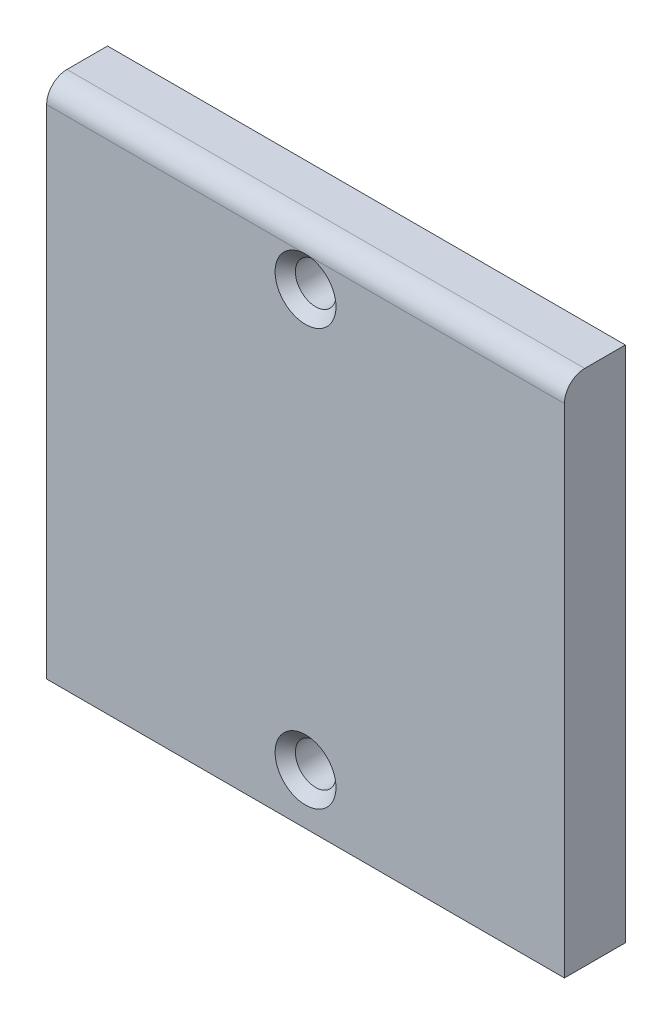
ISO-10303-21;
HEADER;
FILE_DESCRIPTION(('STEP AP214'),'2;1');
FILE_NAME('part.step','',(''),(''),'','','');
FILE_SCHEMA(('AUTOMOTIVE_DESIGN { 1 0 10303 214 1 1 1 1 }'));
ENDSEC;
DATA;
#1=APPLICATION_CONTEXT('core data for automotive mechanical design processes');
#2=APPLICATION_PROTOCOL_DEFINITION('international standard','automotive_design',2000,#1);
#3=PRODUCT_CONTEXT('',#1,'mechanical');
#4=PRODUCT('Part','Part','',(#3));
#5=PRODUCT_RELATED_PRODUCT_CATEGORY('part','',(#4));
#6=PRODUCT_DEFINITION_FORMATION('','',#4);
#7=PRODUCT_DEFINITION_CONTEXT('part definition',#1,'design');
#8=PRODUCT_DEFINITION('design','',#6,#7);
#9=PRODUCT_DEFINITION_SHAPE('','',#8);
#10=(LENGTH_UNIT() NAMED_UNIT(*) SI_UNIT(.MILLI.,.METRE.));
#11=(NAMED_UNIT(*) PLANE_ANGLE_UNIT() SI_UNIT($,.RADIAN.));
#12=(NAMED_UNIT(*) SI_UNIT($,.STERADIAN.) SOLID_ANGLE_UNIT());
#13=UNCERTAINTY_MEASURE_WITH_UNIT(LENGTH_MEASURE(1.E-05),#10,'distance_accuracy_value','');
#14=(GEOMETRIC_REPRESENTATION_CONTEXT(3) GLOBAL_UNCERTAINTY_ASSIGNED_CONTEXT((#13)) GLOBAL_UNIT_ASSIGNED_CONTEXT((#10,
#11,#12)) REPRESENTATION_CONTEXT('',''));
#15=CARTESIAN_POINT('',(0.,0.,0.));
#16=DIRECTION('',(0.,0.,1.));
#17=DIRECTION('',(1.,0.,0.));
#18=AXIS2_PLACEMENT_3D('',#15,#16,#17);
#19=CARTESIAN_POINT('',(-25.5,25.5,6.));
#20=DIRECTION('',(1.,0.,0.));
#21=DIRECTION('',(0.,1.,0.));
#22=AXIS2_PLACEMENT_3D('',#19,#20,#21);
#23=PLANE('',#22);
#24=DIRECTION('',(0.,-1.,0.));
#25=VECTOR('',#24,1.);
#26=CARTESIAN_POINT('',(-25.5,25.5,6.));
#27=LINE('',#26,#25);
#28=CARTESIAN_POINT('',(-25.5,23.5,6.));
#29=VERTEX_POINT('',#28);
#30=CARTESIAN_POINT('',(-25.5,-25.5,6.));
#31=VERTEX_POINT('',#30);
#32=EDGE_CURVE('E373',#29,#31,#27,.T.);
#33=ORIENTED_EDGE('',*,*,#32,.F.);
#34=CARTESIAN_POINT('',(-25.5,23.5,4.));
#35=DIRECTION('',(1.,0.,0.));
#36=DIRECTION('',(0.,1.,0.));
#37=AXIS2_PLACEMENT_3D('',#34,#35,#36);
#38=CIRCLE('',#37,2.);
#39=CARTESIAN_POINT('',(-25.5,25.5,4.));
#40=VERTEX_POINT('',#39);
#41=EDGE_CURVE('E416',#29,#40,#38,.F.);
#42=ORIENTED_EDGE('',*,*,#41,.T.);
#43=DIRECTION('',(0.,0.,-1.));
#44=VECTOR('',#43,1.);
#45=CARTESIAN_POINT('',(-25.5,25.5,6.));
#46=LINE('',#45,#44);
#47=CARTESIAN_POINT('',(-25.5,25.5,0.));
#48=VERTEX_POINT('',#47);
#49=EDGE_CURVE('E384',#40,#48,#46,.T.);
#50=ORIENTED_EDGE('',*,*,#49,.T.);
#51=DIRECTION('',(0.,-1.,0.));
#52=VECTOR('',#51,1.);
#53=CARTESIAN_POINT('',(-25.5,25.5,0.));
#54=LINE('',#53,#52);
#55=CARTESIAN_POINT('',(-25.5,-25.5,0.));
#56=VERTEX_POINT('',#55);
#57=EDGE_CURVE('E363',#48,#56,#54,.T.);
#58=ORIENTED_EDGE('',*,*,#57,.T.);
#59=DIRECTION('',(0.,0.,-1.));
#60=VECTOR('',#59,1.);
#61=CARTESIAN_POINT('',(-25.5,-25.5,6.));
#62=LINE('',#61,#60);
#63=EDGE_CURVE('E407',#31,#56,#62,.T.);
#64=ORIENTED_EDGE('',*,*,#63,.F.);
#65=EDGE_LOOP('',(#33,#42,#50,#58,#64));
#66=FACE_BOUND('',#65,.T.);
#67=ADVANCED_FACE('F46',(#66),#23,.F.);
#68=CARTESIAN_POINT('',(25.5,-25.5,6.));
#69=DIRECTION('',(0.,1.,0.));
#70=DIRECTION('',(-1.,0.,0.));
#71=AXIS2_PLACEMENT_3D('',#68,#69,#70);
#72=PLANE('',#71);
#73=DIRECTION('',(1.,0.,0.));
#74=VECTOR('',#73,1.);
#75=CARTESIAN_POINT('',(25.5,-25.5,0.));
#76=LINE('',#75,#74);
#77=CARTESIAN_POINT('',(25.5,-25.5,0.));
#78=VERTEX_POINT('',#77);
#79=EDGE_CURVE('E388',#56,#78,#76,.T.);
#80=ORIENTED_EDGE('',*,*,#79,.T.);
#81=DIRECTION('',(0.,0.,-1.));
#82=VECTOR('',#81,1.);
#83=CARTESIAN_POINT('',(25.5,-25.5,6.));
#84=LINE('',#83,#82);
#85=CARTESIAN_POINT('',(25.5,-25.5,6.));
#86=VERTEX_POINT('',#85);
#87=EDGE_CURVE('E403',#86,#78,#84,.T.);
#88=ORIENTED_EDGE('',*,*,#87,.F.);
#89=DIRECTION('',(1.,0.,0.));
#90=VECTOR('',#89,1.);
#91=CARTESIAN_POINT('',(25.5,-25.5,6.));
#92=LINE('',#91,#90);
#93=EDGE_CURVE('E376',#31,#86,#92,.T.);
#94=ORIENTED_EDGE('',*,*,#93,.F.);
#95=ORIENTED_EDGE('',*,*,#63,.T.);
#96=EDGE_LOOP('',(#80,#88,#94,#95));
#97=FACE_BOUND('',#96,.T.);
#98=ADVANCED_FACE('F475',(#97),#72,.F.);
#99=CARTESIAN_POINT('',(25.5,25.5,6.));
#100=DIRECTION('',(-1.,0.,0.));
#101=DIRECTION('',(0.,-1.,0.));
#102=AXIS2_PLACEMENT_3D('',#99,#100,#101);
#103=PLANE('',#102);
#104=DIRECTION('',(0.,0.,-1.));
#105=VECTOR('',#104,1.);
#106=CARTESIAN_POINT('',(25.5,25.5,6.));
#107=LINE('',#106,#105);
#108=CARTESIAN_POINT('',(25.5,25.5,4.));
#109=VERTEX_POINT('',#108);
#110=CARTESIAN_POINT('',(25.5,25.5,0.));
#111=VERTEX_POINT('',#110);
#112=EDGE_CURVE('E400',#109,#111,#107,.T.);
#113=ORIENTED_EDGE('',*,*,#112,.F.);
#114=CARTESIAN_POINT('',(25.5,23.5,4.));
#115=DIRECTION('',(-1.,0.,0.));
#116=DIRECTION('',(0.,-1.,0.));
#117=AXIS2_PLACEMENT_3D('',#114,#115,#116);
#118=CIRCLE('',#117,2.);
#119=CARTESIAN_POINT('',(25.5,23.5,6.));
#120=VERTEX_POINT('',#119);
#121=EDGE_CURVE('E421',#109,#120,#118,.F.);
#122=ORIENTED_EDGE('',*,*,#121,.T.);
#123=DIRECTION('',(0.,1.,0.));
#124=VECTOR('',#123,1.);
#125=CARTESIAN_POINT('',(25.5,25.5,6.));
#126=LINE('',#125,#124);
#127=EDGE_CURVE('E380',#86,#120,#126,.T.);
#128=ORIENTED_EDGE('',*,*,#127,.F.);
#129=ORIENTED_EDGE('',*,*,#87,.T.);
#130=DIRECTION('',(0.,1.,0.));
#131=VECTOR('',#130,1.);
#132=CARTESIAN_POINT('',(25.5,25.5,0.));
#133=LINE('',#132,#131);
#134=EDGE_CURVE('E391',#78,#111,#133,.T.);
#135=ORIENTED_EDGE('',*,*,#134,.T.);
#136=EDGE_LOOP('',(#113,#122,#128,#129,#135));
#137=FACE_BOUND('',#136,.T.);
#138=ADVANCED_FACE('F470',(#137),#103,.F.);
#139=CARTESIAN_POINT('',(25.5,25.5,6.));
#140=DIRECTION('',(0.,-1.,0.));
#141=DIRECTION('',(1.,0.,0.));
#142=AXIS2_PLACEMENT_3D('',#139,#140,#141);
#143=PLANE('',#142);
#144=ORIENTED_EDGE('',*,*,#49,.F.);
#145=DIRECTION('',(-1.,0.,0.));
#146=VECTOR('',#145,1.);
#147=CARTESIAN_POINT('',(25.5,25.5,4.));
#148=LINE('',#147,#146);
#149=EDGE_CURVE('E68',#40,#109,#148,.F.);
#150=ORIENTED_EDGE('',*,*,#149,.T.);
#151=ORIENTED_EDGE('',*,*,#112,.T.);
#152=DIRECTION('',(-1.,0.,0.));
#153=VECTOR('',#152,1.);
#154=CARTESIAN_POINT('',(25.5,25.5,0.));
#155=LINE('',#154,#153);
#156=EDGE_CURVE('E377',#111,#48,#155,.T.);
#157=ORIENTED_EDGE('',*,*,#156,.T.);
#158=EDGE_LOOP('',(#144,#150,#151,#157));
#159=FACE_BOUND('',#158,.T.);
#160=ADVANCED_FACE('F467',(#159),#143,.F.);
#161=CARTESIAN_POINT('',(0.,0.,6.));
#162=DIRECTION('',(0.,0.,-1.));
#163=DIRECTION('',(-1.,0.,0.));
#164=AXIS2_PLACEMENT_3D('',#161,#162,#163);
#165=PLANE('',#164);
#166=CARTESIAN_POINT('',(0.,-20.5,6.));
#167=DIRECTION('',(0.,0.,-1.));
#168=DIRECTION('',(-1.,0.,0.));
#169=AXIS2_PLACEMENT_3D('',#166,#167,#168);
#170=CIRCLE('',#169,3.);
#171=CARTESIAN_POINT('',(-3.,-20.5,6.));
#172=VERTEX_POINT('',#171);
#173=EDGE_CURVE('E56',#172,#172,#170,.T.);
#174=ORIENTED_EDGE('',*,*,#173,.T.);
#175=EDGE_LOOP('',(#174));
#176=FACE_BOUND('',#175,.T.);
#177=DIRECTION('',(-1.,0.,0.));
#178=VECTOR('',#177,1.);
#179=CARTESIAN_POINT('',(0.,23.5,6.));
#180=LINE('',#179,#178);
#181=CARTESIAN_POINT('',(0.,23.5,6.));
#182=VERTEX_POINT('',#181);
#183=EDGE_CURVE('E412',#120,#182,#180,.T.);
#184=ORIENTED_EDGE('',*,*,#183,.T.);
#185=CARTESIAN_POINT('',(0.,20.5,6.));
#186=DIRECTION('',(0.,0.,-1.));
#187=DIRECTION('',(-1.,0.,0.));
#188=AXIS2_PLACEMENT_3D('',#185,#186,#187);
#189=CIRCLE('',#188,3.);
#190=EDGE_CURVE('E61',#182,#182,#189,.T.);
#191=ORIENTED_EDGE('',*,*,#190,.T.);
#192=EDGE_CURVE('E411',#182,#29,#180,.T.);
#193=ORIENTED_EDGE('',*,*,#192,.T.);
#194=ORIENTED_EDGE('',*,*,#32,.T.);
#195=ORIENTED_EDGE('',*,*,#93,.T.);
#196=ORIENTED_EDGE('',*,*,#127,.T.);
#197=EDGE_LOOP('',(#184,#191,#193,#194,#195,#196));
#198=FACE_BOUND('',#197,.T.);
#199=ADVANCED_FACE('F433',(#176,#198),#165,.F.);
#200=CARTESIAN_POINT('',(0.,0.,0.));
#201=DIRECTION('',(0.,0.,-1.));
#202=DIRECTION('',(-1.,0.,0.));
#203=AXIS2_PLACEMENT_3D('',#200,#201,#202);
#204=PLANE('',#203);
#205=DIRECTION('',(0.422618261740693,-0.906307787036653,0.));
#206=VECTOR('',#205,1.);
#207=CARTESIAN_POINT('',(14.7321452147779,-2.49999999999998,0.));
#208=LINE('',#207,#206);
#209=CARTESIAN_POINT('',(14.7321452147779,-2.49999999999998,0.));
#210=VERTEX_POINT('',#209);
#211=CARTESIAN_POINT('',(16.,-5.21892336110994,0.));
#212=VERTEX_POINT('',#211);
#213=EDGE_CURVE('E217',#210,#212,#208,.T.);
#214=ORIENTED_EDGE('',*,*,#213,.F.);
#215=DIRECTION('',(0.906307787036653,0.422618261740694,0.));
#216=VECTOR('',#215,1.);
#217=CARTESIAN_POINT('',(14.7321452147779,-2.49999999999998,0.));
#218=LINE('',#217,#216);
#219=CARTESIAN_POINT('',(-23.3327818407615,-20.2499669931091,0.));
#220=VERTEX_POINT('',#219);
#221=EDGE_CURVE('E222',#220,#210,#218,.T.);
#222=ORIENTED_EDGE('',*,*,#221,.F.);
#223=DIRECTION('',(-0.422618261740693,0.906307787036653,0.));
#224=VECTOR('',#223,1.);
#225=CARTESIAN_POINT('',(-23.3327818407615,-20.2499669931091,0.));
#226=LINE('',#225,#224);
#227=CARTESIAN_POINT('',(-22.0649270555394,-22.9688903542191,0.));
#228=VERTEX_POINT('',#227);
#229=EDGE_CURVE('E199',#228,#220,#226,.T.);
#230=ORIENTED_EDGE('',*,*,#229,.F.);
#231=DIRECTION('',(-0.906307787036653,-0.422618261740694,0.));
#232=VECTOR('',#231,1.);
#233=CARTESIAN_POINT('',(16.,-5.21892336110994,0.));
#234=LINE('',#233,#232);
#235=EDGE_CURVE('E211',#212,#228,#234,.T.);
#236=ORIENTED_EDGE('',*,*,#235,.F.);
#237=EDGE_LOOP('',(#214,#222,#230,#236));
#238=FACE_BOUND('',#237,.T.);
#239=DIRECTION('',(0.422618261740693,-0.906307787036653,0.));
#240=VECTOR('',#239,1.);
#241=CARTESIAN_POINT('',(14.7321452147779,7.50000000000002,0.));
#242=LINE('',#241,#240);
#243=CARTESIAN_POINT('',(14.7321452147779,7.50000000000002,0.));
#244=VERTEX_POINT('',#243);
#245=CARTESIAN_POINT('',(16.,4.78107663889006,0.));
#246=VERTEX_POINT('',#245);
#247=EDGE_CURVE('E239',#244,#246,#242,.T.);
#248=ORIENTED_EDGE('',*,*,#247,.F.);
#249=DIRECTION('',(0.906307787036653,0.422618261740694,0.));
#250=VECTOR('',#249,1.);
#251=CARTESIAN_POINT('',(14.7321452147779,7.50000000000002,0.));
#252=LINE('',#251,#250);
#253=CARTESIAN_POINT('',(-23.3327818407615,-10.2499669931091,0.));
#254=VERTEX_POINT('',#253);
#255=EDGE_CURVE('E262',#254,#244,#252,.T.);
#256=ORIENTED_EDGE('',*,*,#255,.F.);
#257=DIRECTION('',(-0.422618261740693,0.906307787036653,0.));
#258=VECTOR('',#257,1.);
#259=CARTESIAN_POINT('',(-23.3327818407615,-10.2499669931091,0.));
#260=LINE('',#259,#258);
#261=CARTESIAN_POINT('',(-22.0649270555394,-12.9688903542191,0.));
#262=VERTEX_POINT('',#261);
#263=EDGE_CURVE('E258',#262,#254,#260,.T.);
#264=ORIENTED_EDGE('',*,*,#263,.F.);
#265=DIRECTION('',(-0.906307787036653,-0.422618261740694,0.));
#266=VECTOR('',#265,1.);
#267=CARTESIAN_POINT('',(16.,4.78107663889006,0.));
#268=LINE('',#267,#266);
#269=EDGE_CURVE('E254',#246,#262,#268,.T.);
#270=ORIENTED_EDGE('',*,*,#269,.F.);
#271=EDGE_LOOP('',(#248,#256,#264,#270));
#272=FACE_BOUND('',#271,.T.);
#273=DIRECTION('',(0.422618261740693,-0.906307787036653,0.));
#274=VECTOR('',#273,1.);
#275=CARTESIAN_POINT('',(14.7321452147779,17.5,0.));
#276=LINE('',#275,#274);
#277=CARTESIAN_POINT('',(14.7321452147779,17.5,0.));
#278=VERTEX_POINT('',#277);
#279=CARTESIAN_POINT('',(16.,14.7810766388901,0.));
#280=VERTEX_POINT('',#279);
#281=EDGE_CURVE('E280',#278,#280,#276,.T.);
#282=ORIENTED_EDGE('',*,*,#281,.F.);
#283=DIRECTION('',(0.906307787036653,0.422618261740694,0.));
#284=VECTOR('',#283,1.);
#285=CARTESIAN_POINT('',(14.7321452147779,17.5,0.));
#286=LINE('',#285,#284);
#287=CARTESIAN_POINT('',(-23.3327818407615,-0.249966993109117,0.));
#288=VERTEX_POINT('',#287);
#289=EDGE_CURVE('E302',#288,#278,#286,.T.);
#290=ORIENTED_EDGE('',*,*,#289,.F.);
#291=DIRECTION('',(-0.422618261740693,0.906307787036653,0.));
#292=VECTOR('',#291,1.);
#293=CARTESIAN_POINT('',(-23.3327818407615,-0.249966993109117,0.));
#294=LINE('',#293,#292);
#295=CARTESIAN_POINT('',(-22.0649270555394,-2.96889035421908,0.));
#296=VERTEX_POINT('',#295);
#297=EDGE_CURVE('E298',#296,#288,#294,.T.);
#298=ORIENTED_EDGE('',*,*,#297,.F.);
#299=DIRECTION('',(-0.906307787036653,-0.422618261740694,0.));
#300=VECTOR('',#299,1.);
#301=CARTESIAN_POINT('',(16.,14.7810766388901,0.));
#302=LINE('',#301,#300);
#303=EDGE_CURVE('E294',#280,#296,#302,.T.);
#304=ORIENTED_EDGE('',*,*,#303,.F.);
#305=EDGE_LOOP('',(#282,#290,#298,#304));
#306=FACE_BOUND('',#305,.T.);
#307=CARTESIAN_POINT('',(0.,-20.5,0.));
#308=DIRECTION('',(0.,0.,1.));
#309=DIRECTION('',(1.,0.,0.));
#310=AXIS2_PLACEMENT_3D('',#307,#308,#309);
#311=CIRCLE('',#310,2.);
#312=CARTESIAN_POINT('',(2.,-20.5,0.));
#313=VERTEX_POINT('',#312);
#314=EDGE_CURVE('E321',#313,#313,#311,.T.);
#315=ORIENTED_EDGE('',*,*,#314,.T.);
#316=EDGE_LOOP('',(#315));
#317=FACE_BOUND('',#316,.T.);
#318=CARTESIAN_POINT('',(0.,20.5,0.));
#319=DIRECTION('',(0.,0.,1.));
#320=DIRECTION('',(1.,0.,0.));
#321=AXIS2_PLACEMENT_3D('',#318,#319,#320);
#322=CIRCLE('',#321,2.);
#323=CARTESIAN_POINT('',(2.,20.5,0.));
#324=VERTEX_POINT('',#323);
#325=EDGE_CURVE('E320',#324,#324,#322,.T.);
#326=ORIENTED_EDGE('',*,*,#325,.T.);
#327=EDGE_LOOP('',(#326));
#328=FACE_BOUND('',#327,.T.);
#329=DIRECTION('',(0.,-1.,0.));
#330=VECTOR('',#329,1.);
#331=CARTESIAN_POINT('',(24.1,12.4,0.));
#332=LINE('',#331,#330);
#333=CARTESIAN_POINT('',(24.1,12.4,0.));
#334=VERTEX_POINT('',#333);
#335=CARTESIAN_POINT('',(24.1,-24.1,0.));
#336=VERTEX_POINT('',#335);
#337=EDGE_CURVE('E325',#334,#336,#332,.T.);
#338=ORIENTED_EDGE('',*,*,#337,.F.);
#339=DIRECTION('',(1.,0.,0.));
#340=VECTOR('',#339,1.);
#341=CARTESIAN_POINT('',(24.1,12.4,0.));
#342=LINE('',#341,#340);
#343=CARTESIAN_POINT('',(17.6,12.4,0.));
#344=VERTEX_POINT('',#343);
#345=EDGE_CURVE('E334',#344,#334,#342,.T.);
#346=ORIENTED_EDGE('',*,*,#345,.F.);
#347=DIRECTION('',(0.,1.,0.));
#348=VECTOR('',#347,1.);
#349=CARTESIAN_POINT('',(17.6,12.4,0.));
#350=LINE('',#349,#348);
#351=CARTESIAN_POINT('',(17.6,-24.1,0.));
#352=VERTEX_POINT('',#351);
#353=EDGE_CURVE('E353',#352,#344,#350,.T.);
#354=ORIENTED_EDGE('',*,*,#353,.F.);
#355=DIRECTION('',(-1.,0.,0.));
#356=VECTOR('',#355,1.);
#357=CARTESIAN_POINT('',(24.1,-24.1,0.));
#358=LINE('',#357,#356);
#359=EDGE_CURVE('E349',#336,#352,#358,.T.);
#360=ORIENTED_EDGE('',*,*,#359,.F.);
#361=EDGE_LOOP('',(#338,#346,#354,#360));
#362=FACE_BOUND('',#361,.T.);
#363=ORIENTED_EDGE('',*,*,#57,.F.);
#364=ORIENTED_EDGE('',*,*,#156,.F.);
#365=ORIENTED_EDGE('',*,*,#134,.F.);
#366=ORIENTED_EDGE('',*,*,#79,.F.);
#367=EDGE_LOOP('',(#363,#364,#365,#366));
#368=FACE_BOUND('',#367,.T.);
#369=ADVANCED_FACE('F219',(#238,#272,#306,#317,#328,#362,#368),#204,.T.);
#370=CARTESIAN_POINT('',(24.1,12.4,4.5));
#371=DIRECTION('',(1.,0.,0.));
#372=DIRECTION('',(0.,1.,0.));
#373=AXIS2_PLACEMENT_3D('',#370,#371,#372);
#374=PLANE('',#373);
#375=ORIENTED_EDGE('',*,*,#337,.T.);
#376=DIRECTION('',(0.,0.,-1.));
#377=VECTOR('',#376,1.);
#378=CARTESIAN_POINT('',(24.1,-24.1,4.5));
#379=LINE('',#378,#377);
#380=CARTESIAN_POINT('',(24.1,-24.1,4.5));
#381=VERTEX_POINT('',#380);
#382=EDGE_CURVE('E346',#381,#336,#379,.T.);
#383=ORIENTED_EDGE('',*,*,#382,.F.);
#384=DIRECTION('',(0.,-1.,0.));
#385=VECTOR('',#384,1.);
#386=CARTESIAN_POINT('',(24.1,12.4,4.5));
#387=LINE('',#386,#385);
#388=CARTESIAN_POINT('',(24.1,12.4,4.5));
#389=VERTEX_POINT('',#388);
#390=EDGE_CURVE('E329',#389,#381,#387,.T.);
#391=ORIENTED_EDGE('',*,*,#390,.F.);
#392=DIRECTION('',(0.,0.,-1.));
#393=VECTOR('',#392,1.);
#394=CARTESIAN_POINT('',(24.1,12.4,4.5));
#395=LINE('',#394,#393);
#396=EDGE_CURVE('E360',#389,#334,#395,.T.);
#397=ORIENTED_EDGE('',*,*,#396,.T.);
#398=EDGE_LOOP('',(#375,#383,#391,#397));
#399=FACE_BOUND('',#398,.T.);
#400=ADVANCED_FACE('F452',(#399),#374,.F.);
#401=CARTESIAN_POINT('',(24.1,12.4,4.5));
#402=DIRECTION('',(0.,1.,0.));
#403=DIRECTION('',(-1.,0.,0.));
#404=AXIS2_PLACEMENT_3D('',#401,#402,#403);
#405=PLANE('',#404);
#406=ORIENTED_EDGE('',*,*,#345,.T.);
#407=ORIENTED_EDGE('',*,*,#396,.F.);
#408=DIRECTION('',(1.,0.,0.));
#409=VECTOR('',#408,1.);
#410=CARTESIAN_POINT('',(24.1,12.4,4.5));
#411=LINE('',#410,#409);
#412=CARTESIAN_POINT('',(17.6,12.4,4.5));
#413=VERTEX_POINT('',#412);
#414=EDGE_CURVE('E342',#413,#389,#411,.T.);
#415=ORIENTED_EDGE('',*,*,#414,.F.);
#416=DIRECTION('',(0.,0.,-1.));
#417=VECTOR('',#416,1.);
#418=CARTESIAN_POINT('',(17.6,12.4,4.5));
#419=LINE('',#418,#417);
#420=EDGE_CURVE('E364',#413,#344,#419,.T.);
#421=ORIENTED_EDGE('',*,*,#420,.T.);
#422=EDGE_LOOP('',(#406,#407,#415,#421));
#423=FACE_BOUND('',#422,.T.);
#424=ADVANCED_FACE('F504',(#423),#405,.F.);
#425=CARTESIAN_POINT('',(17.6,12.4,4.5));
#426=DIRECTION('',(-1.,0.,0.));
#427=DIRECTION('',(0.,-1.,0.));
#428=AXIS2_PLACEMENT_3D('',#425,#426,#427);
#429=PLANE('',#428);
#430=ORIENTED_EDGE('',*,*,#353,.T.);
#431=ORIENTED_EDGE('',*,*,#420,.F.);
#432=DIRECTION('',(0.,1.,0.));
#433=VECTOR('',#432,1.);
#434=CARTESIAN_POINT('',(17.6,12.4,4.5));
#435=LINE('',#434,#433);
#436=CARTESIAN_POINT('',(17.6,-24.1,4.5));
#437=VERTEX_POINT('',#436);
#438=EDGE_CURVE('E338',#437,#413,#435,.T.);
#439=ORIENTED_EDGE('',*,*,#438,.F.);
#440=DIRECTION('',(0.,0.,-1.));
#441=VECTOR('',#440,1.);
#442=CARTESIAN_POINT('',(17.6,-24.1,4.5));
#443=LINE('',#442,#441);
#444=EDGE_CURVE('E367',#437,#352,#443,.T.);
#445=ORIENTED_EDGE('',*,*,#444,.T.);
#446=EDGE_LOOP('',(#430,#431,#439,#445));
#447=FACE_BOUND('',#446,.T.);
#448=ADVANCED_FACE('F510',(#447),#429,.F.);
#449=CARTESIAN_POINT('',(24.1,-24.1,4.5));
#450=DIRECTION('',(0.,-1.,0.));
#451=DIRECTION('',(1.,0.,0.));
#452=AXIS2_PLACEMENT_3D('',#449,#450,#451);
#453=PLANE('',#452);
#454=ORIENTED_EDGE('',*,*,#359,.T.);
#455=ORIENTED_EDGE('',*,*,#444,.F.);
#456=DIRECTION('',(-1.,0.,0.));
#457=VECTOR('',#456,1.);
#458=CARTESIAN_POINT('',(24.1,-24.1,4.5));
#459=LINE('',#458,#457);
#460=EDGE_CURVE('E333',#381,#437,#459,.T.);
#461=ORIENTED_EDGE('',*,*,#460,.F.);
#462=ORIENTED_EDGE('',*,*,#382,.T.);
#463=EDGE_LOOP('',(#454,#455,#461,#462));
#464=FACE_BOUND('',#463,.T.);
#465=ADVANCED_FACE('F506',(#464),#453,.F.);
#466=CARTESIAN_POINT('',(0.,0.,4.5));
#467=DIRECTION('',(0.,0.,-1.));
#468=DIRECTION('',(-1.,0.,0.));
#469=AXIS2_PLACEMENT_3D('',#466,#467,#468);
#470=PLANE('',#469);
#471=ORIENTED_EDGE('',*,*,#390,.T.);
#472=ORIENTED_EDGE('',*,*,#460,.T.);
#473=ORIENTED_EDGE('',*,*,#438,.T.);
#474=ORIENTED_EDGE('',*,*,#414,.T.);
#475=EDGE_LOOP('',(#471,#472,#473,#474));
#476=FACE_BOUND('',#475,.T.);
#477=ADVANCED_FACE('F509',(#476),#470,.T.);
#478=CARTESIAN_POINT('',(0.,20.5,0.));
#479=DIRECTION('',(0.,0.,1.));
#480=DIRECTION('',(1.,0.,0.));
#481=AXIS2_PLACEMENT_3D('',#478,#479,#480);
#482=CYLINDRICAL_SURFACE('',#481,2.);
#483=CARTESIAN_POINT('',(0.,20.5,5.00000000000001));
#484=DIRECTION('',(0.,0.,-1.));
#485=DIRECTION('',(-1.,0.,0.));
#486=AXIS2_PLACEMENT_3D('',#483,#484,#485);
#487=CIRCLE('',#486,2.);
#488=CARTESIAN_POINT('',(-2.,20.5,5.00000000000001));
#489=VERTEX_POINT('',#488);
#490=EDGE_CURVE('E11',#489,#489,#487,.F.);
#491=ORIENTED_EDGE('',*,*,#490,.T.);
#492=EDGE_LOOP('',(#491));
#493=FACE_BOUND('',#492,.T.);
#494=ORIENTED_EDGE('',*,*,#325,.F.);
#495=EDGE_LOOP('',(#494));
#496=FACE_BOUND('',#495,.T.);
#497=ADVANCED_FACE('F446',(#493,#496),#482,.F.);
#498=CARTESIAN_POINT('',(0.,-20.5,0.));
#499=DIRECTION('',(0.,0.,1.));
#500=DIRECTION('',(1.,0.,0.));
#501=AXIS2_PLACEMENT_3D('',#498,#499,#500);
#502=CYLINDRICAL_SURFACE('',#501,2.);
#503=CARTESIAN_POINT('',(0.,-20.5,5.00000000000001));
#504=DIRECTION('',(0.,0.,-1.));
#505=DIRECTION('',(-1.,0.,0.));
#506=AXIS2_PLACEMENT_3D('',#503,#504,#505);
#507=CIRCLE('',#506,2.);
#508=CARTESIAN_POINT('',(-2.,-20.5,5.00000000000001));
#509=VERTEX_POINT('',#508);
#510=EDGE_CURVE('E424',#509,#509,#507,.F.);
#511=ORIENTED_EDGE('',*,*,#510,.T.);
#512=EDGE_LOOP('',(#511));
#513=FACE_BOUND('',#512,.T.);
#514=ORIENTED_EDGE('',*,*,#314,.F.);
#515=EDGE_LOOP('',(#514));
#516=FACE_BOUND('',#515,.T.);
#517=ADVANCED_FACE('F442',(#513,#516),#502,.F.);
#518=CARTESIAN_POINT('',(14.7321452147779,17.5,48.8400856975489));
#519=DIRECTION('',(0.906307787036653,0.422618261740693,0.));
#520=DIRECTION('',(-0.422618261740693,0.906307787036653,0.));
#521=AXIS2_PLACEMENT_3D('',#518,#519,#520);
#522=PLANE('',#521);
#523=DIRECTION('',(-0.422618261740693,0.906307787036653,0.));
#524=VECTOR('',#523,1.);
#525=CARTESIAN_POINT('',(14.7321452147779,17.5,4.5));
#526=LINE('',#525,#524);
#527=CARTESIAN_POINT('',(16.,14.7810766388901,4.5));
#528=VERTEX_POINT('',#527);
#529=CARTESIAN_POINT('',(14.7321452147779,17.5,4.5));
#530=VERTEX_POINT('',#529);
#531=EDGE_CURVE('E288',#528,#530,#526,.T.);
#532=ORIENTED_EDGE('',*,*,#531,.T.);
#533=DIRECTION('',(0.,0.,-1.));
#534=VECTOR('',#533,1.);
#535=CARTESIAN_POINT('',(14.7321452147779,17.5,48.8400856975489));
#536=LINE('',#535,#534);
#537=EDGE_CURVE('E285',#530,#278,#536,.T.);
#538=ORIENTED_EDGE('',*,*,#537,.T.);
#539=ORIENTED_EDGE('',*,*,#281,.T.);
#540=DIRECTION('',(0.,0.,-1.));
#541=VECTOR('',#540,1.);
#542=CARTESIAN_POINT('',(16.,14.7810766388901,48.8400856975489));
#543=LINE('',#542,#541);
#544=EDGE_CURVE('E306',#528,#280,#543,.T.);
#545=ORIENTED_EDGE('',*,*,#544,.F.);
#546=EDGE_LOOP('',(#532,#538,#539,#545));
#547=FACE_BOUND('',#546,.T.);
#548=ADVANCED_FACE('F445',(#547),#522,.F.);
#549=CARTESIAN_POINT('',(14.7321452147779,17.5,48.8400856975489));
#550=DIRECTION('',(-0.422618261740694,0.906307787036653,0.));
#551=DIRECTION('',(-0.906307787036653,-0.422618261740694,0.));
#552=AXIS2_PLACEMENT_3D('',#549,#550,#551);
#553=PLANE('',#552);
#554=DIRECTION('',(-0.906307787036653,-0.422618261740694,0.));
#555=VECTOR('',#554,1.);
#556=CARTESIAN_POINT('',(14.7321452147779,17.5,4.5));
#557=LINE('',#556,#555);
#558=CARTESIAN_POINT('',(-23.3327818407615,-0.249966993109117,4.5));
#559=VERTEX_POINT('',#558);
#560=EDGE_CURVE('E284',#530,#559,#557,.T.);
#561=ORIENTED_EDGE('',*,*,#560,.T.);
#562=DIRECTION('',(0.,0.,-1.));
#563=VECTOR('',#562,1.);
#564=CARTESIAN_POINT('',(-23.3327818407615,-0.249966993109117,48.8400856975489));
#565=LINE('',#564,#563);
#566=EDGE_CURVE('E309',#559,#288,#565,.T.);
#567=ORIENTED_EDGE('',*,*,#566,.T.);
#568=ORIENTED_EDGE('',*,*,#289,.T.);
#569=ORIENTED_EDGE('',*,*,#537,.F.);
#570=EDGE_LOOP('',(#561,#567,#568,#569));
#571=FACE_BOUND('',#570,.T.);
#572=ADVANCED_FACE('F526',(#571),#553,.F.);
#573=CARTESIAN_POINT('',(-23.3327818407615,-0.249966993109117,48.8400856975489));
#574=DIRECTION('',(-0.906307787036653,-0.422618261740693,0.));
#575=DIRECTION('',(0.422618261740693,-0.906307787036653,0.));
#576=AXIS2_PLACEMENT_3D('',#573,#574,#575);
#577=PLANE('',#576);
#578=DIRECTION('',(0.422618261740693,-0.906307787036653,0.));
#579=VECTOR('',#578,1.);
#580=CARTESIAN_POINT('',(-23.3327818407615,-0.249966993109117,4.5));
#581=LINE('',#580,#579);
#582=CARTESIAN_POINT('',(-22.0649270555394,-2.96889035421908,4.5));
#583=VERTEX_POINT('',#582);
#584=EDGE_CURVE('E281',#559,#583,#581,.T.);
#585=ORIENTED_EDGE('',*,*,#584,.T.);
#586=DIRECTION('',(0.,0.,-1.));
#587=VECTOR('',#586,1.);
#588=CARTESIAN_POINT('',(-22.0649270555394,-2.96889035421908,48.8400856975489));
#589=LINE('',#588,#587);
#590=EDGE_CURVE('E312',#583,#296,#589,.T.);
#591=ORIENTED_EDGE('',*,*,#590,.T.);
#592=ORIENTED_EDGE('',*,*,#297,.T.);
#593=ORIENTED_EDGE('',*,*,#566,.F.);
#594=EDGE_LOOP('',(#585,#591,#592,#593));
#595=FACE_BOUND('',#594,.T.);
#596=ADVANCED_FACE('F532',(#595),#577,.F.);
#597=CARTESIAN_POINT('',(16.,14.7810766388901,48.8400856975489));
#598=DIRECTION('',(0.422618261740694,-0.906307787036653,0.));
#599=DIRECTION('',(0.906307787036653,0.422618261740694,0.));
#600=AXIS2_PLACEMENT_3D('',#597,#598,#599);
#601=PLANE('',#600);
#602=DIRECTION('',(0.906307787036653,0.422618261740694,0.));
#603=VECTOR('',#602,1.);
#604=CARTESIAN_POINT('',(16.,14.7810766388901,4.5));
#605=LINE('',#604,#603);
#606=EDGE_CURVE('E291',#583,#528,#605,.T.);
#607=ORIENTED_EDGE('',*,*,#606,.T.);
#608=ORIENTED_EDGE('',*,*,#544,.T.);
#609=ORIENTED_EDGE('',*,*,#303,.T.);
#610=ORIENTED_EDGE('',*,*,#590,.F.);
#611=EDGE_LOOP('',(#607,#608,#609,#610));
#612=FACE_BOUND('',#611,.T.);
#613=ADVANCED_FACE('F528',(#612),#601,.F.);
#614=CARTESIAN_POINT('',(0.,0.,4.5));
#615=DIRECTION('',(0.,0.,-1.));
#616=DIRECTION('',(-1.,0.,0.));
#617=AXIS2_PLACEMENT_3D('',#614,#615,#616);
#618=PLANE('',#617);
#619=ORIENTED_EDGE('',*,*,#531,.F.);
#620=ORIENTED_EDGE('',*,*,#606,.F.);
#621=ORIENTED_EDGE('',*,*,#584,.F.);
#622=ORIENTED_EDGE('',*,*,#560,.F.);
#623=EDGE_LOOP('',(#619,#620,#621,#622));
#624=FACE_BOUND('',#623,.T.);
#625=ADVANCED_FACE('F531',(#624),#618,.T.);
#626=CARTESIAN_POINT('',(14.7321452147779,7.50000000000002,48.8400856975489));
#627=DIRECTION('',(0.906307787036653,0.422618261740693,0.));
#628=DIRECTION('',(-0.422618261740693,0.906307787036653,0.));
#629=AXIS2_PLACEMENT_3D('',#626,#627,#628);
#630=PLANE('',#629);
#631=DIRECTION('',(-0.422618261740693,0.906307787036653,0.));
#632=VECTOR('',#631,1.);
#633=CARTESIAN_POINT('',(14.7321452147779,7.50000000000002,4.5));
#634=LINE('',#633,#632);
#635=CARTESIAN_POINT('',(16.,4.78107663889006,4.5));
#636=VERTEX_POINT('',#635);
#637=CARTESIAN_POINT('',(14.7321452147779,7.50000000000002,4.5));
#638=VERTEX_POINT('',#637);
#639=EDGE_CURVE('E248',#636,#638,#634,.T.);
#640=ORIENTED_EDGE('',*,*,#639,.T.);
#641=DIRECTION('',(0.,0.,-1.));
#642=VECTOR('',#641,1.);
#643=CARTESIAN_POINT('',(14.7321452147779,7.50000000000002,48.8400856975489));
#644=LINE('',#643,#642);
#645=EDGE_CURVE('E245',#638,#244,#644,.T.);
#646=ORIENTED_EDGE('',*,*,#645,.T.);
#647=ORIENTED_EDGE('',*,*,#247,.T.);
#648=DIRECTION('',(0.,0.,-1.));
#649=VECTOR('',#648,1.);
#650=CARTESIAN_POINT('',(16.,4.78107663889006,48.8400856975489));
#651=LINE('',#650,#649);
#652=EDGE_CURVE('E266',#636,#246,#651,.T.);
#653=ORIENTED_EDGE('',*,*,#652,.F.);
#654=EDGE_LOOP('',(#640,#646,#647,#653));
#655=FACE_BOUND('',#654,.T.);
#656=ADVANCED_FACE('F542',(#655),#630,.F.);
#657=CARTESIAN_POINT('',(14.7321452147779,7.50000000000002,48.8400856975489));
#658=DIRECTION('',(-0.422618261740694,0.906307787036653,0.));
#659=DIRECTION('',(-0.906307787036653,-0.422618261740694,0.));
#660=AXIS2_PLACEMENT_3D('',#657,#658,#659);
#661=PLANE('',#660);
#662=DIRECTION('',(-0.906307787036653,-0.422618261740694,0.));
#663=VECTOR('',#662,1.);
#664=CARTESIAN_POINT('',(14.7321452147779,7.50000000000002,4.5));
#665=LINE('',#664,#663);
#666=CARTESIAN_POINT('',(-23.3327818407615,-10.2499669931091,4.5));
#667=VERTEX_POINT('',#666);
#668=EDGE_CURVE('E244',#638,#667,#665,.T.);
#669=ORIENTED_EDGE('',*,*,#668,.T.);
#670=DIRECTION('',(0.,0.,-1.));
#671=VECTOR('',#670,1.);
#672=CARTESIAN_POINT('',(-23.3327818407615,-10.2499669931091,48.8400856975489));
#673=LINE('',#672,#671);
#674=EDGE_CURVE('E269',#667,#254,#673,.T.);
#675=ORIENTED_EDGE('',*,*,#674,.T.);
#676=ORIENTED_EDGE('',*,*,#255,.T.);
#677=ORIENTED_EDGE('',*,*,#645,.F.);
#678=EDGE_LOOP('',(#669,#675,#676,#677));
#679=FACE_BOUND('',#678,.T.);
#680=ADVANCED_FACE('F546',(#679),#661,.F.);
#681=CARTESIAN_POINT('',(-23.3327818407615,-10.2499669931091,48.8400856975489));
#682=DIRECTION('',(-0.906307787036653,-0.422618261740693,0.));
#683=DIRECTION('',(0.422618261740693,-0.906307787036653,0.));
#684=AXIS2_PLACEMENT_3D('',#681,#682,#683);
#685=PLANE('',#684);
#686=DIRECTION('',(0.422618261740693,-0.906307787036653,0.));
#687=VECTOR('',#686,1.);
#688=CARTESIAN_POINT('',(-23.3327818407615,-10.2499669931091,4.5));
#689=LINE('',#688,#687);
#690=CARTESIAN_POINT('',(-22.0649270555394,-12.9688903542191,4.5));
#691=VERTEX_POINT('',#690);
#692=EDGE_CURVE('E241',#667,#691,#689,.T.);
#693=ORIENTED_EDGE('',*,*,#692,.T.);
#694=DIRECTION('',(0.,0.,-1.));
#695=VECTOR('',#694,1.);
#696=CARTESIAN_POINT('',(-22.0649270555394,-12.9688903542191,48.8400856975489));
#697=LINE('',#696,#695);
#698=EDGE_CURVE('E272',#691,#262,#697,.T.);
#699=ORIENTED_EDGE('',*,*,#698,.T.);
#700=ORIENTED_EDGE('',*,*,#263,.T.);
#701=ORIENTED_EDGE('',*,*,#674,.F.);
#702=EDGE_LOOP('',(#693,#699,#700,#701));
#703=FACE_BOUND('',#702,.T.);
#704=ADVANCED_FACE('F552',(#703),#685,.F.);
#705=CARTESIAN_POINT('',(16.,4.78107663889006,48.8400856975489));
#706=DIRECTION('',(0.422618261740694,-0.906307787036653,0.));
#707=DIRECTION('',(0.906307787036653,0.422618261740694,0.));
#708=AXIS2_PLACEMENT_3D('',#705,#706,#707);
#709=PLANE('',#708);
#710=DIRECTION('',(0.906307787036653,0.422618261740694,0.));
#711=VECTOR('',#710,1.);
#712=CARTESIAN_POINT('',(16.,4.78107663889006,4.5));
#713=LINE('',#712,#711);
#714=EDGE_CURVE('E251',#691,#636,#713,.T.);
#715=ORIENTED_EDGE('',*,*,#714,.T.);
#716=ORIENTED_EDGE('',*,*,#652,.T.);
#717=ORIENTED_EDGE('',*,*,#269,.T.);
#718=ORIENTED_EDGE('',*,*,#698,.F.);
#719=EDGE_LOOP('',(#715,#716,#717,#718));
#720=FACE_BOUND('',#719,.T.);
#721=ADVANCED_FACE('F548',(#720),#709,.F.);
#722=CARTESIAN_POINT('',(0.,0.,4.5));
#723=DIRECTION('',(0.,0.,-1.));
#724=DIRECTION('',(-1.,0.,0.));
#725=AXIS2_PLACEMENT_3D('',#722,#723,#724);
#726=PLANE('',#725);
#727=ORIENTED_EDGE('',*,*,#639,.F.);
#728=ORIENTED_EDGE('',*,*,#714,.F.);
#729=ORIENTED_EDGE('',*,*,#692,.F.);
#730=ORIENTED_EDGE('',*,*,#668,.F.);
#731=EDGE_LOOP('',(#727,#728,#729,#730));
#732=FACE_BOUND('',#731,.T.);
#733=ADVANCED_FACE('F551',(#732),#726,.T.);
#734=CARTESIAN_POINT('',(14.7321452147779,-2.49999999999998,48.8400856975489));
#735=DIRECTION('',(0.906307787036653,0.422618261740693,0.));
#736=DIRECTION('',(-0.422618261740693,0.906307787036653,0.));
#737=AXIS2_PLACEMENT_3D('',#734,#735,#736);
#738=PLANE('',#737);
#739=DIRECTION('',(-0.422618261740693,0.906307787036653,0.));
#740=VECTOR('',#739,1.);
#741=CARTESIAN_POINT('',(14.7321452147779,-2.49999999999998,4.5));
#742=LINE('',#741,#740);
#743=CARTESIAN_POINT('',(16.,-5.21892336110994,4.5));
#744=VERTEX_POINT('',#743);
#745=CARTESIAN_POINT('',(14.7321452147779,-2.49999999999998,4.5));
#746=VERTEX_POINT('',#745);
#747=EDGE_CURVE('E240',#744,#746,#742,.T.);
#748=ORIENTED_EDGE('',*,*,#747,.T.);
#749=DIRECTION('',(0.,0.,-1.));
#750=VECTOR('',#749,1.);
#751=CARTESIAN_POINT('',(14.7321452147779,-2.49999999999998,48.8400856975489));
#752=LINE('',#751,#750);
#753=EDGE_CURVE('E229',#746,#210,#752,.T.);
#754=ORIENTED_EDGE('',*,*,#753,.T.);
#755=ORIENTED_EDGE('',*,*,#213,.T.);
#756=DIRECTION('',(0.,0.,-1.));
#757=VECTOR('',#756,1.);
#758=CARTESIAN_POINT('',(16.,-5.21892336110994,48.8400856975489));
#759=LINE('',#758,#757);
#760=EDGE_CURVE('E207',#744,#212,#759,.T.);
#761=ORIENTED_EDGE('',*,*,#760,.F.);
#762=EDGE_LOOP('',(#748,#754,#755,#761));
#763=FACE_BOUND('',#762,.T.);
#764=ADVANCED_FACE('F562',(#763),#738,.F.);
#765=CARTESIAN_POINT('',(14.7321452147779,-2.49999999999998,48.8400856975489));
#766=DIRECTION('',(-0.422618261740694,0.906307787036653,0.));
#767=DIRECTION('',(-0.906307787036653,-0.422618261740694,0.));
#768=AXIS2_PLACEMENT_3D('',#765,#766,#767);
#769=PLANE('',#768);
#770=DIRECTION('',(-0.906307787036653,-0.422618261740694,0.));
#771=VECTOR('',#770,1.);
#772=CARTESIAN_POINT('',(14.7321452147779,-2.49999999999998,4.5));
#773=LINE('',#772,#771);
#774=CARTESIAN_POINT('',(-23.3327818407615,-20.2499669931091,4.5));
#775=VERTEX_POINT('',#774);
#776=EDGE_CURVE('E578',#746,#775,#773,.T.);
#777=ORIENTED_EDGE('',*,*,#776,.T.);
#778=DIRECTION('',(0.,0.,-1.));
#779=VECTOR('',#778,1.);
#780=CARTESIAN_POINT('',(-23.3327818407615,-20.2499669931091,48.8400856975489));
#781=LINE('',#780,#779);
#782=EDGE_CURVE('E206',#775,#220,#781,.T.);
#783=ORIENTED_EDGE('',*,*,#782,.T.);
#784=ORIENTED_EDGE('',*,*,#221,.T.);
#785=ORIENTED_EDGE('',*,*,#753,.F.);
#786=EDGE_LOOP('',(#777,#783,#784,#785));
#787=FACE_BOUND('',#786,.T.);
#788=ADVANCED_FACE('F566',(#787),#769,.F.);
#789=CARTESIAN_POINT('',(-23.3327818407615,-20.2499669931091,48.8400856975489));
#790=DIRECTION('',(-0.906307787036653,-0.422618261740693,0.));
#791=DIRECTION('',(0.422618261740693,-0.906307787036653,0.));
#792=AXIS2_PLACEMENT_3D('',#789,#790,#791);
#793=PLANE('',#792);
#794=DIRECTION('',(0.422618261740693,-0.906307787036653,0.));
#795=VECTOR('',#794,1.);
#796=CARTESIAN_POINT('',(-23.3327818407615,-20.2499669931091,4.5));
#797=LINE('',#796,#795);
#798=CARTESIAN_POINT('',(-22.0649270555394,-22.9688903542191,4.5));
#799=VERTEX_POINT('',#798);
#800=EDGE_CURVE('E202',#775,#799,#797,.T.);
#801=ORIENTED_EDGE('',*,*,#800,.T.);
#802=DIRECTION('',(0.,0.,-1.));
#803=VECTOR('',#802,1.);
#804=CARTESIAN_POINT('',(-22.0649270555394,-22.9688903542191,48.8400856975489));
#805=LINE('',#804,#803);
#806=EDGE_CURVE('E194',#799,#228,#805,.T.);
#807=ORIENTED_EDGE('',*,*,#806,.T.);
#808=ORIENTED_EDGE('',*,*,#229,.T.);
#809=ORIENTED_EDGE('',*,*,#782,.F.);
#810=EDGE_LOOP('',(#801,#807,#808,#809));
#811=FACE_BOUND('',#810,.T.);
#812=ADVANCED_FACE('F196',(#811),#793,.F.);
#813=CARTESIAN_POINT('',(16.,-5.21892336110994,48.8400856975489));
#814=DIRECTION('',(0.422618261740694,-0.906307787036653,0.));
#815=DIRECTION('',(0.906307787036653,0.422618261740694,0.));
#816=AXIS2_PLACEMENT_3D('',#813,#814,#815);
#817=PLANE('',#816);
#818=DIRECTION('',(0.906307787036653,0.422618261740694,0.));
#819=VECTOR('',#818,1.);
#820=CARTESIAN_POINT('',(16.,-5.21892336110994,4.5));
#821=LINE('',#820,#819);
#822=EDGE_CURVE('E236',#799,#744,#821,.T.);
#823=ORIENTED_EDGE('',*,*,#822,.T.);
#824=ORIENTED_EDGE('',*,*,#760,.T.);
#825=ORIENTED_EDGE('',*,*,#235,.T.);
#826=ORIENTED_EDGE('',*,*,#806,.F.);
#827=EDGE_LOOP('',(#823,#824,#825,#826));
#828=FACE_BOUND('',#827,.T.);
#829=ADVANCED_FACE('F212',(#828),#817,.F.);
#830=CARTESIAN_POINT('',(0.,0.,4.5));
#831=DIRECTION('',(0.,0.,-1.));
#832=DIRECTION('',(-1.,0.,0.));
#833=AXIS2_PLACEMENT_3D('',#830,#831,#832);
#834=PLANE('',#833);
#835=ORIENTED_EDGE('',*,*,#747,.F.);
#836=ORIENTED_EDGE('',*,*,#822,.F.);
#837=ORIENTED_EDGE('',*,*,#800,.F.);
#838=ORIENTED_EDGE('',*,*,#776,.F.);
#839=EDGE_LOOP('',(#835,#836,#837,#838));
#840=FACE_BOUND('',#839,.T.);
#841=ADVANCED_FACE('F481',(#840),#834,.T.);
#842=CARTESIAN_POINT('',(0.,23.5,4.));
#843=DIRECTION('',(-1.,0.,0.));
#844=DIRECTION('',(0.,-1.,0.));
#845=AXIS2_PLACEMENT_3D('',#842,#843,#844);
#846=CYLINDRICAL_SURFACE('',#845,2.);
#847=ORIENTED_EDGE('',*,*,#121,.F.);
#848=ORIENTED_EDGE('',*,*,#149,.F.);
#849=ORIENTED_EDGE('',*,*,#41,.F.);
#850=ORIENTED_EDGE('',*,*,#192,.F.);
#851=ORIENTED_EDGE('',*,*,#183,.F.);
#852=EDGE_LOOP('',(#847,#848,#849,#850,#851));
#853=FACE_BOUND('',#852,.T.);
#854=ADVANCED_FACE('F439',(#853),#846,.T.);
#855=CARTESIAN_POINT('',(0.,-20.5,5.00000000000001));
#856=DIRECTION('',(0.,0.,1.));
#857=DIRECTION('',(1.,0.,0.));
#858=AXIS2_PLACEMENT_3D('',#855,#856,#857);
#859=CONICAL_SURFACE('',#858,2.,0.785398163397452);
#860=ORIENTED_EDGE('',*,*,#173,.F.);
#861=EDGE_LOOP('',(#860));
#862=FACE_BOUND('',#861,.T.);
#863=ORIENTED_EDGE('',*,*,#510,.F.);
#864=EDGE_LOOP('',(#863));
#865=FACE_BOUND('',#864,.T.);
#866=ADVANCED_FACE('F436',(#862,#865),#859,.F.);
#867=CARTESIAN_POINT('',(0.,20.5,5.00000000000001));
#868=DIRECTION('',(0.,0.,1.));
#869=DIRECTION('',(1.,0.,0.));
#870=AXIS2_PLACEMENT_3D('',#867,#868,#869);
#871=CONICAL_SURFACE('',#870,2.,0.785398163397452);
#872=ORIENTED_EDGE('',*,*,#190,.F.);
#873=EDGE_LOOP('',(#872));
#874=FACE_BOUND('',#873,.T.);
#875=ORIENTED_EDGE('',*,*,#490,.F.);
#876=EDGE_LOOP('',(#875));
#877=FACE_BOUND('',#876,.T.);
#878=ADVANCED_FACE('F49',(#874,#877),#871,.F.);
#879=CLOSED_SHELL('',(#67,#98,#138,#160,#199,#369,#400,#424,#448,#465,#477,#497,#517,#548,#572,
#596,#613,#625,#656,#680,#704,#721,#733,#764,#788,#812,#829,#841,#854,#866,#878));
#880=MANIFOLD_SOLID_BREP('B2',#879);
#881=ADVANCED_BREP_SHAPE_REPRESENTATION('',(#18,#880),#14);
#882=SHAPE_DEFINITION_REPRESENTATION(#9,#881);
ENDSEC;
END-ISO-10303-21;
